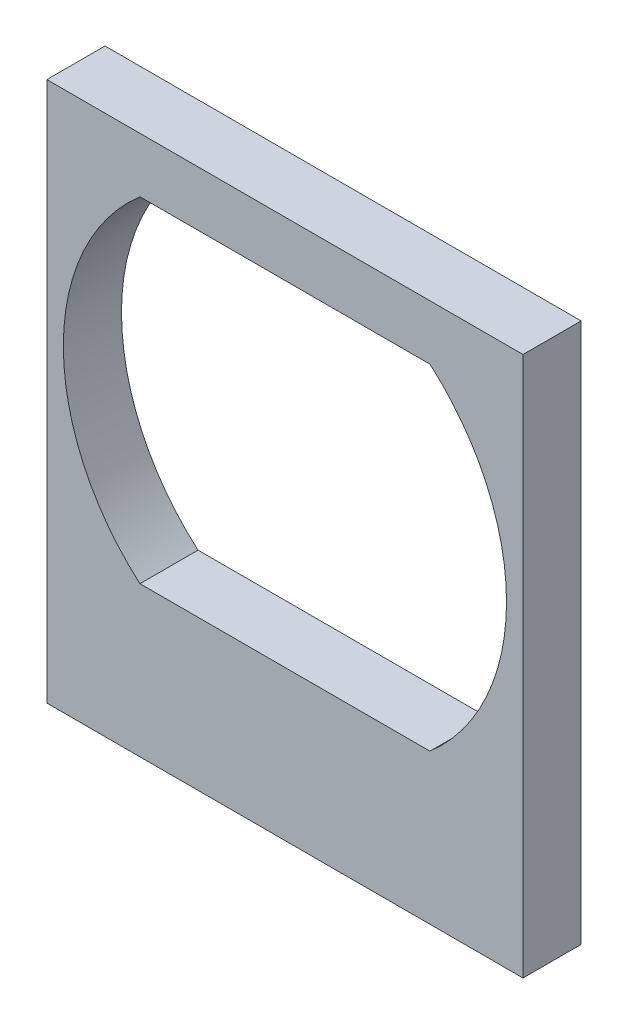
ISO-10303-21;
HEADER;
FILE_DESCRIPTION(('STEP AP214'),'2;1');
FILE_NAME('part.step','',(''),(''),'','','');
FILE_SCHEMA(('AUTOMOTIVE_DESIGN { 1 0 10303 214 1 1 1 1 }'));
ENDSEC;
DATA;
#1=APPLICATION_CONTEXT('core data for automotive mechanical design processes');
#2=APPLICATION_PROTOCOL_DEFINITION('international standard','automotive_design',2000,#1);
#3=PRODUCT_CONTEXT('',#1,'mechanical');
#4=PRODUCT('Part','Part','',(#3));
#5=PRODUCT_RELATED_PRODUCT_CATEGORY('part','',(#4));
#6=PRODUCT_DEFINITION_FORMATION('','',#4);
#7=PRODUCT_DEFINITION_CONTEXT('part definition',#1,'design');
#8=PRODUCT_DEFINITION('design','',#6,#7);
#9=PRODUCT_DEFINITION_SHAPE('','',#8);
#10=(LENGTH_UNIT() NAMED_UNIT(*) SI_UNIT(.MILLI.,.METRE.));
#11=(NAMED_UNIT(*) PLANE_ANGLE_UNIT() SI_UNIT($,.RADIAN.));
#12=(NAMED_UNIT(*) SI_UNIT($,.STERADIAN.) SOLID_ANGLE_UNIT());
#13=UNCERTAINTY_MEASURE_WITH_UNIT(LENGTH_MEASURE(1.E-05),#10,'distance_accuracy_value','');
#14=(GEOMETRIC_REPRESENTATION_CONTEXT(3) GLOBAL_UNCERTAINTY_ASSIGNED_CONTEXT((#13)) GLOBAL_UNIT_ASSIGNED_CONTEXT((#10,
#11,#12)) REPRESENTATION_CONTEXT('',''));
#15=CARTESIAN_POINT('',(0.,0.,0.));
#16=DIRECTION('',(0.,0.,1.));
#17=DIRECTION('',(1.,0.,0.));
#18=AXIS2_PLACEMENT_3D('',#15,#16,#17);
#19=CARTESIAN_POINT('',(0.,0.,3.175));
#20=DIRECTION('',(0.,0.,1.));
#21=DIRECTION('',(1.,0.,0.));
#22=AXIS2_PLACEMENT_3D('',#19,#20,#21);
#23=PLANE('',#22);
#24=DIRECTION('',(1.,0.,0.));
#25=VECTOR('',#24,1.);
#26=CARTESIAN_POINT('',(-13.,-17.337,3.175));
#27=LINE('',#26,#25);
#28=CARTESIAN_POINT('',(-13.,-17.337,3.175));
#29=VERTEX_POINT('',#28);
#30=CARTESIAN_POINT('',(13.,-17.337,3.175));
#31=VERTEX_POINT('',#30);
#32=EDGE_CURVE('E164',#29,#31,#27,.T.);
#33=ORIENTED_EDGE('',*,*,#32,.T.);
#34=DIRECTION('',(0.,1.,0.));
#35=VECTOR('',#34,1.);
#36=CARTESIAN_POINT('',(13.,-17.337,3.175));
#37=LINE('',#36,#35);
#38=CARTESIAN_POINT('',(13.,12.15,3.175));
#39=VERTEX_POINT('',#38);
#40=EDGE_CURVE('E167',#31,#39,#37,.T.);
#41=ORIENTED_EDGE('',*,*,#40,.T.);
#42=DIRECTION('',(-1.,0.,0.));
#43=VECTOR('',#42,1.);
#44=CARTESIAN_POINT('',(-13.,12.15,3.175));
#45=LINE('',#44,#43);
#46=CARTESIAN_POINT('',(-13.,12.15,3.175));
#47=VERTEX_POINT('',#46);
#48=EDGE_CURVE('E170',#39,#47,#45,.T.);
#49=ORIENTED_EDGE('',*,*,#48,.T.);
#50=DIRECTION('',(0.,-1.,0.));
#51=VECTOR('',#50,1.);
#52=CARTESIAN_POINT('',(-13.,-17.337,3.175));
#53=LINE('',#52,#51);
#54=EDGE_CURVE('E172',#47,#29,#53,.T.);
#55=ORIENTED_EDGE('',*,*,#54,.T.);
#56=EDGE_LOOP('',(#33,#41,#49,#55));
#57=FACE_BOUND('',#56,.T.);
#58=DIRECTION('',(-1.,0.,0.));
#59=VECTOR('',#58,1.);
#60=CARTESIAN_POINT('',(-7.91754381105656,9.15,3.175));
#61=LINE('',#60,#59);
#62=CARTESIAN_POINT('',(7.91754381105656,9.15,3.175));
#63=VERTEX_POINT('',#62);
#64=CARTESIAN_POINT('',(-7.91754381105656,9.15,3.175));
#65=VERTEX_POINT('',#64);
#66=EDGE_CURVE('E140',#63,#65,#61,.T.);
#67=ORIENTED_EDGE('',*,*,#66,.F.);
#68=CARTESIAN_POINT('',(0.,0.,3.175));
#69=DIRECTION('',(0.,0.,1.));
#70=DIRECTION('',(1.,0.,0.));
#71=AXIS2_PLACEMENT_3D('',#68,#69,#70);
#72=CIRCLE('',#71,12.1);
#73=CARTESIAN_POINT('',(7.91754381105656,-9.15,3.175));
#74=VERTEX_POINT('',#73);
#75=EDGE_CURVE('E138',#74,#63,#72,.T.);
#76=ORIENTED_EDGE('',*,*,#75,.F.);
#77=DIRECTION('',(1.,0.,0.));
#78=VECTOR('',#77,1.);
#79=CARTESIAN_POINT('',(-7.91754381105656,-9.15,3.175));
#80=LINE('',#79,#78);
#81=CARTESIAN_POINT('',(-7.91754381105656,-9.15,3.175));
#82=VERTEX_POINT('',#81);
#83=EDGE_CURVE('E145',#82,#74,#80,.T.);
#84=ORIENTED_EDGE('',*,*,#83,.F.);
#85=CARTESIAN_POINT('',(0.,0.,3.175));
#86=DIRECTION('',(0.,0.,1.));
#87=DIRECTION('',(1.,0.,0.));
#88=AXIS2_PLACEMENT_3D('',#85,#86,#87);
#89=CIRCLE('',#88,12.1);
#90=EDGE_CURVE('E143',#65,#82,#89,.T.);
#91=ORIENTED_EDGE('',*,*,#90,.F.);
#92=EDGE_LOOP('',(#67,#76,#84,#91));
#93=FACE_BOUND('',#92,.T.);
#94=ADVANCED_FACE('F41',(#57,#93),#23,.T.);
#95=CARTESIAN_POINT('',(0.,0.,0.));
#96=DIRECTION('',(0.,0.,1.));
#97=DIRECTION('',(1.,0.,0.));
#98=AXIS2_PLACEMENT_3D('',#95,#96,#97);
#99=PLANE('',#98);
#100=DIRECTION('',(1.,0.,0.));
#101=VECTOR('',#100,1.);
#102=CARTESIAN_POINT('',(-13.,-17.337,0.));
#103=LINE('',#102,#101);
#104=CARTESIAN_POINT('',(-13.,-17.337,0.));
#105=VERTEX_POINT('',#104);
#106=CARTESIAN_POINT('',(13.,-17.337,0.));
#107=VERTEX_POINT('',#106);
#108=EDGE_CURVE('E163',#105,#107,#103,.T.);
#109=ORIENTED_EDGE('',*,*,#108,.F.);
#110=DIRECTION('',(0.,-1.,0.));
#111=VECTOR('',#110,1.);
#112=CARTESIAN_POINT('',(-13.,-17.337,0.));
#113=LINE('',#112,#111);
#114=CARTESIAN_POINT('',(-13.,12.15,0.));
#115=VERTEX_POINT('',#114);
#116=EDGE_CURVE('E168',#115,#105,#113,.T.);
#117=ORIENTED_EDGE('',*,*,#116,.F.);
#118=DIRECTION('',(-1.,0.,0.));
#119=VECTOR('',#118,1.);
#120=CARTESIAN_POINT('',(-13.,12.15,0.));
#121=LINE('',#120,#119);
#122=CARTESIAN_POINT('',(13.,12.15,0.));
#123=VERTEX_POINT('',#122);
#124=EDGE_CURVE('E179',#123,#115,#121,.T.);
#125=ORIENTED_EDGE('',*,*,#124,.F.);
#126=DIRECTION('',(0.,1.,0.));
#127=VECTOR('',#126,1.);
#128=CARTESIAN_POINT('',(13.,-17.337,0.));
#129=LINE('',#128,#127);
#130=EDGE_CURVE('E177',#107,#123,#129,.T.);
#131=ORIENTED_EDGE('',*,*,#130,.F.);
#132=EDGE_LOOP('',(#109,#117,#125,#131));
#133=FACE_BOUND('',#132,.T.);
#134=CARTESIAN_POINT('',(0.,0.,0.));
#135=DIRECTION('',(0.,0.,1.));
#136=DIRECTION('',(1.,0.,0.));
#137=AXIS2_PLACEMENT_3D('',#134,#135,#136);
#138=CIRCLE('',#137,12.1);
#139=CARTESIAN_POINT('',(7.91754381105656,-9.15,0.));
#140=VERTEX_POINT('',#139);
#141=CARTESIAN_POINT('',(7.91754381105656,9.15,0.));
#142=VERTEX_POINT('',#141);
#143=EDGE_CURVE('E64',#140,#142,#138,.T.);
#144=ORIENTED_EDGE('',*,*,#143,.T.);
#145=DIRECTION('',(-1.,0.,0.));
#146=VECTOR('',#145,1.);
#147=CARTESIAN_POINT('',(-7.91754381105656,9.15,0.));
#148=LINE('',#147,#146);
#149=CARTESIAN_POINT('',(-7.91754381105656,9.15,0.));
#150=VERTEX_POINT('',#149);
#151=EDGE_CURVE('E149',#142,#150,#148,.T.);
#152=ORIENTED_EDGE('',*,*,#151,.T.);
#153=CARTESIAN_POINT('',(0.,0.,0.));
#154=DIRECTION('',(0.,0.,1.));
#155=DIRECTION('',(1.,0.,0.));
#156=AXIS2_PLACEMENT_3D('',#153,#154,#155);
#157=CIRCLE('',#156,12.1);
#158=CARTESIAN_POINT('',(-7.91754381105656,-9.15,0.));
#159=VERTEX_POINT('',#158);
#160=EDGE_CURVE('E152',#150,#159,#157,.T.);
#161=ORIENTED_EDGE('',*,*,#160,.T.);
#162=DIRECTION('',(1.,0.,0.));
#163=VECTOR('',#162,1.);
#164=CARTESIAN_POINT('',(-7.91754381105656,-9.15,0.));
#165=LINE('',#164,#163);
#166=EDGE_CURVE('E141',#159,#140,#165,.T.);
#167=ORIENTED_EDGE('',*,*,#166,.T.);
#168=EDGE_LOOP('',(#144,#152,#161,#167));
#169=FACE_BOUND('',#168,.T.);
#170=ADVANCED_FACE('F197',(#133,#169),#99,.F.);
#171=CARTESIAN_POINT('',(-13.,-17.337,3.175));
#172=DIRECTION('',(0.,1.,0.));
#173=DIRECTION('',(0.,0.,1.));
#174=AXIS2_PLACEMENT_3D('',#171,#172,#173);
#175=PLANE('',#174);
#176=CARTESIAN_POINT('',(7.5,-17.337,1.5875));
#177=DIRECTION('',(0.,-1.,0.));
#178=DIRECTION('',(0.,0.,-1.));
#179=AXIS2_PLACEMENT_3D('',#176,#177,#178);
#180=CIRCLE('',#179,1.275);
#181=CARTESIAN_POINT('',(7.5,-17.337,0.3125));
#182=VERTEX_POINT('',#181);
#183=EDGE_CURVE('E129',#182,#182,#180,.T.);
#184=ORIENTED_EDGE('',*,*,#183,.F.);
#185=EDGE_LOOP('',(#184));
#186=FACE_BOUND('',#185,.T.);
#187=CARTESIAN_POINT('',(-7.5,-17.337,1.5875));
#188=DIRECTION('',(0.,-1.,0.));
#189=DIRECTION('',(0.,0.,-1.));
#190=AXIS2_PLACEMENT_3D('',#187,#188,#189);
#191=CIRCLE('',#190,1.275);
#192=CARTESIAN_POINT('',(-7.5,-17.337,0.312500000000001));
#193=VERTEX_POINT('',#192);
#194=EDGE_CURVE('E122',#193,#193,#191,.T.);
#195=ORIENTED_EDGE('',*,*,#194,.F.);
#196=EDGE_LOOP('',(#195));
#197=FACE_BOUND('',#196,.T.);
#198=ORIENTED_EDGE('',*,*,#108,.T.);
#199=DIRECTION('',(0.,0.,-1.));
#200=VECTOR('',#199,1.);
#201=CARTESIAN_POINT('',(13.,-17.337,3.175));
#202=LINE('',#201,#200);
#203=EDGE_CURVE('E11',#31,#107,#202,.T.);
#204=ORIENTED_EDGE('',*,*,#203,.F.);
#205=ORIENTED_EDGE('',*,*,#32,.F.);
#206=DIRECTION('',(0.,0.,-1.));
#207=VECTOR('',#206,1.);
#208=CARTESIAN_POINT('',(-13.,-17.337,3.175));
#209=LINE('',#208,#207);
#210=EDGE_CURVE('E174',#29,#105,#209,.T.);
#211=ORIENTED_EDGE('',*,*,#210,.T.);
#212=EDGE_LOOP('',(#198,#204,#205,#211));
#213=FACE_BOUND('',#212,.T.);
#214=ADVANCED_FACE('F43',(#186,#197,#213),#175,.F.);
#215=CARTESIAN_POINT('',(13.,-17.337,3.175));
#216=DIRECTION('',(-1.,0.,0.));
#217=DIRECTION('',(0.,0.,1.));
#218=AXIS2_PLACEMENT_3D('',#215,#216,#217);
#219=PLANE('',#218);
#220=ORIENTED_EDGE('',*,*,#130,.T.);
#221=DIRECTION('',(0.,0.,-1.));
#222=VECTOR('',#221,1.);
#223=CARTESIAN_POINT('',(13.,12.15,3.175));
#224=LINE('',#223,#222);
#225=EDGE_CURVE('E49',#39,#123,#224,.T.);
#226=ORIENTED_EDGE('',*,*,#225,.F.);
#227=ORIENTED_EDGE('',*,*,#40,.F.);
#228=ORIENTED_EDGE('',*,*,#203,.T.);
#229=EDGE_LOOP('',(#220,#226,#227,#228));
#230=FACE_BOUND('',#229,.T.);
#231=ADVANCED_FACE('F208',(#230),#219,.F.);
#232=CARTESIAN_POINT('',(-13.,12.15,3.175));
#233=DIRECTION('',(0.,-1.,0.));
#234=DIRECTION('',(0.,0.,-1.));
#235=AXIS2_PLACEMENT_3D('',#232,#233,#234);
#236=PLANE('',#235);
#237=ORIENTED_EDGE('',*,*,#124,.T.);
#238=DIRECTION('',(0.,0.,-1.));
#239=VECTOR('',#238,1.);
#240=CARTESIAN_POINT('',(-13.,12.15,3.175));
#241=LINE('',#240,#239);
#242=EDGE_CURVE('E184',#47,#115,#241,.T.);
#243=ORIENTED_EDGE('',*,*,#242,.F.);
#244=ORIENTED_EDGE('',*,*,#48,.F.);
#245=ORIENTED_EDGE('',*,*,#225,.T.);
#246=EDGE_LOOP('',(#237,#243,#244,#245));
#247=FACE_BOUND('',#246,.T.);
#248=ADVANCED_FACE('F191',(#247),#236,.F.);
#249=CARTESIAN_POINT('',(-13.,-17.337,3.175));
#250=DIRECTION('',(1.,0.,0.));
#251=DIRECTION('',(0.,0.,-1.));
#252=AXIS2_PLACEMENT_3D('',#249,#250,#251);
#253=PLANE('',#252);
#254=ORIENTED_EDGE('',*,*,#116,.T.);
#255=ORIENTED_EDGE('',*,*,#210,.F.);
#256=ORIENTED_EDGE('',*,*,#54,.F.);
#257=ORIENTED_EDGE('',*,*,#242,.T.);
#258=EDGE_LOOP('',(#254,#255,#256,#257));
#259=FACE_BOUND('',#258,.T.);
#260=ADVANCED_FACE('F201',(#259),#253,.F.);
#261=CARTESIAN_POINT('',(0.,0.,3.175));
#262=DIRECTION('',(0.,0.,-1.));
#263=DIRECTION('',(-1.,0.,0.));
#264=AXIS2_PLACEMENT_3D('',#261,#262,#263);
#265=CYLINDRICAL_SURFACE('',#264,12.1);
#266=ORIENTED_EDGE('',*,*,#143,.F.);
#267=DIRECTION('',(0.,0.,-1.));
#268=VECTOR('',#267,1.);
#269=CARTESIAN_POINT('',(7.91754381105656,-9.15,3.175));
#270=LINE('',#269,#268);
#271=EDGE_CURVE('E147',#74,#140,#270,.T.);
#272=ORIENTED_EDGE('',*,*,#271,.F.);
#273=ORIENTED_EDGE('',*,*,#75,.T.);
#274=DIRECTION('',(0.,0.,-1.));
#275=VECTOR('',#274,1.);
#276=CARTESIAN_POINT('',(7.91754381105656,9.15,3.175));
#277=LINE('',#276,#275);
#278=EDGE_CURVE('E161',#63,#142,#277,.T.);
#279=ORIENTED_EDGE('',*,*,#278,.T.);
#280=EDGE_LOOP('',(#266,#272,#273,#279));
#281=FACE_BOUND('',#280,.T.);
#282=ADVANCED_FACE('F224',(#281),#265,.F.);
#283=CARTESIAN_POINT('',(-7.91754381105656,9.15,3.175));
#284=DIRECTION('',(0.,-1.,0.));
#285=DIRECTION('',(1.,0.,0.));
#286=AXIS2_PLACEMENT_3D('',#283,#284,#285);
#287=PLANE('',#286);
#288=ORIENTED_EDGE('',*,*,#151,.F.);
#289=ORIENTED_EDGE('',*,*,#278,.F.);
#290=ORIENTED_EDGE('',*,*,#66,.T.);
#291=DIRECTION('',(0.,0.,-1.));
#292=VECTOR('',#291,1.);
#293=CARTESIAN_POINT('',(-7.91754381105656,9.15,3.175));
#294=LINE('',#293,#292);
#295=EDGE_CURVE('E159',#65,#150,#294,.T.);
#296=ORIENTED_EDGE('',*,*,#295,.T.);
#297=EDGE_LOOP('',(#288,#289,#290,#296));
#298=FACE_BOUND('',#297,.T.);
#299=ADVANCED_FACE('F230',(#298),#287,.T.);
#300=CARTESIAN_POINT('',(0.,0.,3.175));
#301=DIRECTION('',(0.,0.,-1.));
#302=DIRECTION('',(-1.,0.,0.));
#303=AXIS2_PLACEMENT_3D('',#300,#301,#302);
#304=CYLINDRICAL_SURFACE('',#303,12.1);
#305=ORIENTED_EDGE('',*,*,#160,.F.);
#306=ORIENTED_EDGE('',*,*,#295,.F.);
#307=ORIENTED_EDGE('',*,*,#90,.T.);
#308=DIRECTION('',(0.,0.,-1.));
#309=VECTOR('',#308,1.);
#310=CARTESIAN_POINT('',(-7.91754381105656,-9.15,3.175));
#311=LINE('',#310,#309);
#312=EDGE_CURVE('E56',#82,#159,#311,.T.);
#313=ORIENTED_EDGE('',*,*,#312,.T.);
#314=EDGE_LOOP('',(#305,#306,#307,#313));
#315=FACE_BOUND('',#314,.T.);
#316=ADVANCED_FACE('F234',(#315),#304,.F.);
#317=CARTESIAN_POINT('',(-7.91754381105656,-9.15,3.175));
#318=DIRECTION('',(0.,1.,0.));
#319=DIRECTION('',(-1.,0.,0.));
#320=AXIS2_PLACEMENT_3D('',#317,#318,#319);
#321=PLANE('',#320);
#322=ORIENTED_EDGE('',*,*,#166,.F.);
#323=ORIENTED_EDGE('',*,*,#312,.F.);
#324=ORIENTED_EDGE('',*,*,#83,.T.);
#325=ORIENTED_EDGE('',*,*,#271,.T.);
#326=EDGE_LOOP('',(#322,#323,#324,#325));
#327=FACE_BOUND('',#326,.T.);
#328=ADVANCED_FACE('F239',(#327),#321,.T.);
#329=CARTESIAN_POINT('',(-7.5,-11.337,1.5875));
#330=DIRECTION('',(0.,-1.,0.));
#331=DIRECTION('',(0.,0.,-1.));
#332=AXIS2_PLACEMENT_3D('',#329,#330,#331);
#333=CONICAL_SURFACE('',#332,1.25,1.02974425867665);
#334=CARTESIAN_POINT('',(-7.5,-10.5859242262155,1.5875));
#335=VERTEX_POINT('',#334);
#336=VERTEX_LOOP('',#335);
#337=FACE_BOUND('',#336,.T.);
#338=CARTESIAN_POINT('',(-7.5,-11.337,1.5875));
#339=DIRECTION('',(0.,-1.,0.));
#340=DIRECTION('',(0.,0.,-1.));
#341=AXIS2_PLACEMENT_3D('',#338,#339,#340);
#342=CIRCLE('',#341,1.25);
#343=CARTESIAN_POINT('',(-7.5,-11.337,0.337500000000001));
#344=VERTEX_POINT('',#343);
#345=EDGE_CURVE('E135',#344,#344,#342,.T.);
#346=ORIENTED_EDGE('',*,*,#345,.T.);
#347=EDGE_LOOP('',(#346));
#348=FACE_BOUND('',#347,.T.);
#349=ADVANCED_FACE('F245',(#337,#348),#333,.F.);
#350=CARTESIAN_POINT('',(-7.5,-17.337,1.5875));
#351=DIRECTION('',(0.,-1.,0.));
#352=DIRECTION('',(0.,0.,-1.));
#353=AXIS2_PLACEMENT_3D('',#350,#351,#352);
#354=CYLINDRICAL_SURFACE('',#353,1.25);
#355=ORIENTED_EDGE('',*,*,#345,.F.);
#356=EDGE_LOOP('',(#355));
#357=FACE_BOUND('',#356,.T.);
#358=CARTESIAN_POINT('',(-7.5,-17.312,1.5875));
#359=DIRECTION('',(0.,-1.,0.));
#360=DIRECTION('',(0.,0.,-1.));
#361=AXIS2_PLACEMENT_3D('',#358,#359,#360);
#362=CIRCLE('',#361,1.25);
#363=CARTESIAN_POINT('',(-7.5,-17.312,0.337500000000001));
#364=VERTEX_POINT('',#363);
#365=EDGE_CURVE('E126',#364,#364,#362,.T.);
#366=ORIENTED_EDGE('',*,*,#365,.T.);
#367=EDGE_LOOP('',(#366));
#368=FACE_BOUND('',#367,.T.);
#369=ADVANCED_FACE('F248',(#357,#368),#354,.F.);
#370=CARTESIAN_POINT('',(-7.5,-17.337,1.5875));
#371=DIRECTION('',(0.,-1.,0.));
#372=DIRECTION('',(0.,0.,-1.));
#373=AXIS2_PLACEMENT_3D('',#370,#371,#372);
#374=CONICAL_SURFACE('',#373,1.275,0.785398163397362);
#375=ORIENTED_EDGE('',*,*,#365,.F.);
#376=EDGE_LOOP('',(#375));
#377=FACE_BOUND('',#376,.T.);
#378=ORIENTED_EDGE('',*,*,#194,.T.);
#379=EDGE_LOOP('',(#378));
#380=FACE_BOUND('',#379,.T.);
#381=ADVANCED_FACE('F116',(#377,#380),#374,.F.);
#382=CARTESIAN_POINT('',(7.5,-11.337,1.5875));
#383=DIRECTION('',(0.,-1.,0.));
#384=DIRECTION('',(0.,0.,-1.));
#385=AXIS2_PLACEMENT_3D('',#382,#383,#384);
#386=CONICAL_SURFACE('',#385,1.25,1.02974425867665);
#387=CARTESIAN_POINT('',(7.5,-10.5859242262155,1.5875));
#388=VERTEX_POINT('',#387);
#389=VERTEX_LOOP('',#388);
#390=FACE_BOUND('',#389,.T.);
#391=CARTESIAN_POINT('',(7.5,-11.337,1.5875));
#392=DIRECTION('',(0.,-1.,0.));
#393=DIRECTION('',(0.,0.,-1.));
#394=AXIS2_PLACEMENT_3D('',#391,#392,#393);
#395=CIRCLE('',#394,1.25);
#396=CARTESIAN_POINT('',(7.5,-11.337,0.337500000000001));
#397=VERTEX_POINT('',#396);
#398=EDGE_CURVE('E120',#397,#397,#395,.T.);
#399=ORIENTED_EDGE('',*,*,#398,.T.);
#400=EDGE_LOOP('',(#399));
#401=FACE_BOUND('',#400,.T.);
#402=ADVANCED_FACE('F112',(#390,#401),#386,.F.);
#403=CARTESIAN_POINT('',(7.5,-17.337,1.5875));
#404=DIRECTION('',(0.,-1.,0.));
#405=DIRECTION('',(0.,0.,-1.));
#406=AXIS2_PLACEMENT_3D('',#403,#404,#405);
#407=CYLINDRICAL_SURFACE('',#406,1.25);
#408=ORIENTED_EDGE('',*,*,#398,.F.);
#409=EDGE_LOOP('',(#408));
#410=FACE_BOUND('',#409,.T.);
#411=CARTESIAN_POINT('',(7.5,-17.312,1.5875));
#412=DIRECTION('',(0.,-1.,0.));
#413=DIRECTION('',(0.,0.,-1.));
#414=AXIS2_PLACEMENT_3D('',#411,#412,#413);
#415=CIRCLE('',#414,1.25);
#416=CARTESIAN_POINT('',(7.5,-17.312,0.337500000000001));
#417=VERTEX_POINT('',#416);
#418=EDGE_CURVE('E123',#417,#417,#415,.T.);
#419=ORIENTED_EDGE('',*,*,#418,.T.);
#420=EDGE_LOOP('',(#419));
#421=FACE_BOUND('',#420,.T.);
#422=ADVANCED_FACE('F115',(#410,#421),#407,.F.);
#423=CARTESIAN_POINT('',(7.5,-17.337,1.5875));
#424=DIRECTION('',(0.,-1.,0.));
#425=DIRECTION('',(0.,0.,-1.));
#426=AXIS2_PLACEMENT_3D('',#423,#424,#425);
#427=CONICAL_SURFACE('',#426,1.275,0.785398163397379);
#428=ORIENTED_EDGE('',*,*,#418,.F.);
#429=EDGE_LOOP('',(#428));
#430=FACE_BOUND('',#429,.T.);
#431=ORIENTED_EDGE('',*,*,#183,.T.);
#432=EDGE_LOOP('',(#431));
#433=FACE_BOUND('',#432,.T.);
#434=ADVANCED_FACE('F258',(#430,#433),#427,.F.);
#435=CLOSED_SHELL('',(#94,#170,#214,#231,#248,#260,#282,#299,#316,#328,#349,#369,#381,#402,#422,#434));
#436=MANIFOLD_SOLID_BREP('B2',#435);
#437=ADVANCED_BREP_SHAPE_REPRESENTATION('',(#18,#436),#14);
#438=SHAPE_DEFINITION_REPRESENTATION(#9,#437);
ENDSEC;
END-ISO-10303-21;
